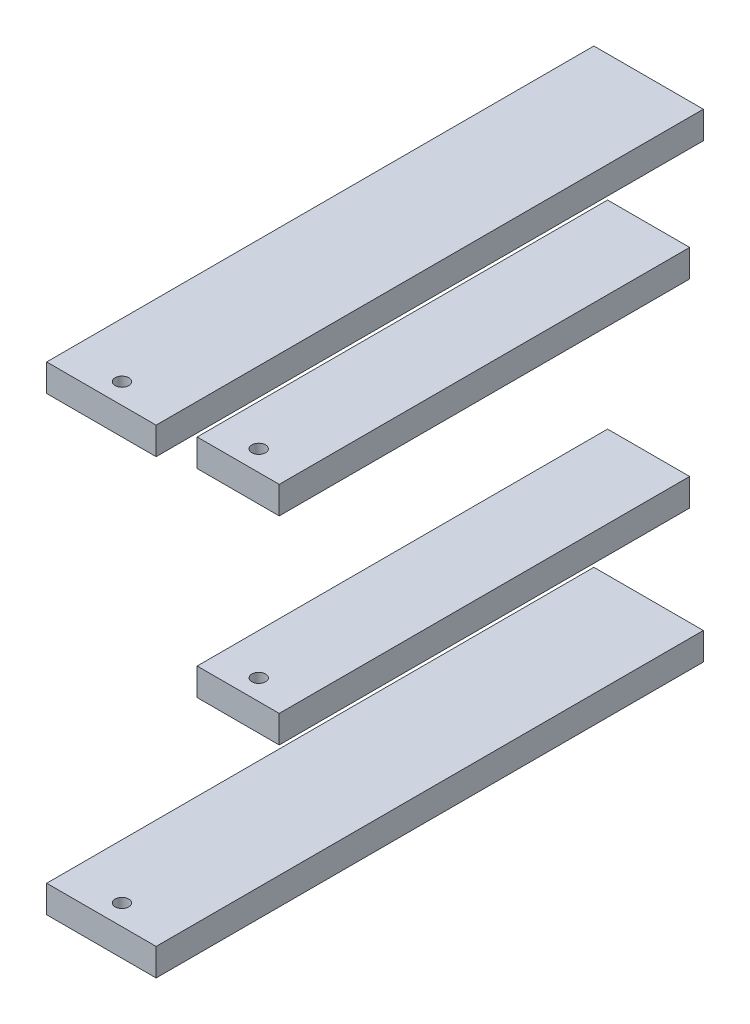
ISO-10303-21;
HEADER;
FILE_DESCRIPTION(('STEP AP214'),'2;1');
FILE_NAME('part.step','',(''),(''),'','','');
FILE_SCHEMA(('AUTOMOTIVE_DESIGN { 1 0 10303 214 1 1 1 1 }'));
ENDSEC;
DATA;
#1=APPLICATION_CONTEXT('core data for automotive mechanical design processes');
#2=APPLICATION_PROTOCOL_DEFINITION('international standard','automotive_design',2000,#1);
#3=PRODUCT_CONTEXT('',#1,'mechanical');
#4=PRODUCT('Part','Part','',(#3));
#5=PRODUCT_RELATED_PRODUCT_CATEGORY('part','',(#4));
#6=PRODUCT_DEFINITION_FORMATION('','',#4);
#7=PRODUCT_DEFINITION_CONTEXT('part definition',#1,'design');
#8=PRODUCT_DEFINITION('design','',#6,#7);
#9=PRODUCT_DEFINITION_SHAPE('','',#8);
#10=(LENGTH_UNIT() NAMED_UNIT(*) SI_UNIT(.MILLI.,.METRE.));
#11=(NAMED_UNIT(*) PLANE_ANGLE_UNIT() SI_UNIT($,.RADIAN.));
#12=(NAMED_UNIT(*) SI_UNIT($,.STERADIAN.) SOLID_ANGLE_UNIT());
#13=UNCERTAINTY_MEASURE_WITH_UNIT(LENGTH_MEASURE(1.E-05),#10,'distance_accuracy_value','');
#14=(GEOMETRIC_REPRESENTATION_CONTEXT(3) GLOBAL_UNCERTAINTY_ASSIGNED_CONTEXT((#13)) GLOBAL_UNIT_ASSIGNED_CONTEXT((#10,
#11,#12)) REPRESENTATION_CONTEXT('',''));
#15=CARTESIAN_POINT('',(0.,0.,0.));
#16=DIRECTION('',(0.,0.,1.));
#17=DIRECTION('',(1.,0.,0.));
#18=AXIS2_PLACEMENT_3D('',#15,#16,#17);
#19=CARTESIAN_POINT('',(-30.,-62.5,300.));
#20=DIRECTION('',(0.,-1.,0.));
#21=DIRECTION('',(1.,0.,0.));
#22=AXIS2_PLACEMENT_3D('',#19,#20,#21);
#23=PLANE('',#22);
#24=CARTESIAN_POINT('',(0.,-62.4999999999999,285.));
#25=DIRECTION('',(0.,-1.,0.));
#26=DIRECTION('',(1.,0.,0.));
#27=AXIS2_PLACEMENT_3D('',#24,#25,#26);
#28=CIRCLE('',#27,5.00000000000002);
#29=CARTESIAN_POINT('',(5.00000000000004,-62.4999999999999,285.));
#30=VERTEX_POINT('',#29);
#31=EDGE_CURVE('E111',#30,#30,#28,.T.);
#32=ORIENTED_EDGE('',*,*,#31,.T.);
#33=EDGE_LOOP('',(#32));
#34=FACE_BOUND('',#33,.T.);
#35=DIRECTION('',(-1.,0.,0.));
#36=VECTOR('',#35,1.);
#37=CARTESIAN_POINT('',(-30.,-62.5,0.));
#38=LINE('',#37,#36);
#39=CARTESIAN_POINT('',(30.0000000000001,-62.4999999999999,0.));
#40=VERTEX_POINT('',#39);
#41=CARTESIAN_POINT('',(-30.,-62.5,0.));
#42=VERTEX_POINT('',#41);
#43=EDGE_CURVE('E108',#40,#42,#38,.T.);
#44=ORIENTED_EDGE('',*,*,#43,.T.);
#45=DIRECTION('',(0.,0.,-1.));
#46=VECTOR('',#45,1.);
#47=CARTESIAN_POINT('',(-30.,-62.5,300.));
#48=LINE('',#47,#46);
#49=CARTESIAN_POINT('',(-30.,-62.5,300.));
#50=VERTEX_POINT('',#49);
#51=EDGE_CURVE('E12',#50,#42,#48,.T.);
#52=ORIENTED_EDGE('',*,*,#51,.F.);
#53=DIRECTION('',(-1.,0.,0.));
#54=VECTOR('',#53,1.);
#55=CARTESIAN_POINT('',(-30.,-62.5,300.));
#56=LINE('',#55,#54);
#57=CARTESIAN_POINT('',(30.0000000000001,-62.4999999999999,300.));
#58=VERTEX_POINT('',#57);
#59=EDGE_CURVE('E96',#58,#50,#56,.T.);
#60=ORIENTED_EDGE('',*,*,#59,.F.);
#61=DIRECTION('',(0.,0.,-1.));
#62=VECTOR('',#61,1.);
#63=CARTESIAN_POINT('',(30.0000000000001,-62.4999999999999,300.));
#64=LINE('',#63,#62);
#65=EDGE_CURVE('E104',#58,#40,#64,.T.);
#66=ORIENTED_EDGE('',*,*,#65,.T.);
#67=EDGE_LOOP('',(#44,#52,#60,#66));
#68=FACE_BOUND('',#67,.T.);
#69=ADVANCED_FACE('F45',(#34,#68),#23,.F.);
#70=CARTESIAN_POINT('',(-30.,-62.5,300.));
#71=DIRECTION('',(1.,0.,0.));
#72=DIRECTION('',(0.,0.,-1.));
#73=AXIS2_PLACEMENT_3D('',#70,#71,#72);
#74=PLANE('',#73);
#75=DIRECTION('',(0.,-1.,0.));
#76=VECTOR('',#75,1.);
#77=CARTESIAN_POINT('',(-30.,-62.5,0.));
#78=LINE('',#77,#76);
#79=CARTESIAN_POINT('',(-30.,-82.5,0.));
#80=VERTEX_POINT('',#79);
#81=EDGE_CURVE('E100',#42,#80,#78,.T.);
#82=ORIENTED_EDGE('',*,*,#81,.T.);
#83=DIRECTION('',(0.,0.,-1.));
#84=VECTOR('',#83,1.);
#85=CARTESIAN_POINT('',(-30.,-82.5,300.));
#86=LINE('',#85,#84);
#87=CARTESIAN_POINT('',(-30.,-82.5,300.));
#88=VERTEX_POINT('',#87);
#89=EDGE_CURVE('E53',#88,#80,#86,.T.);
#90=ORIENTED_EDGE('',*,*,#89,.F.);
#91=DIRECTION('',(0.,-1.,0.));
#92=VECTOR('',#91,1.);
#93=CARTESIAN_POINT('',(-30.,-62.5,300.));
#94=LINE('',#93,#92);
#95=EDGE_CURVE('E91',#50,#88,#94,.T.);
#96=ORIENTED_EDGE('',*,*,#95,.F.);
#97=ORIENTED_EDGE('',*,*,#51,.T.);
#98=EDGE_LOOP('',(#82,#90,#96,#97));
#99=FACE_BOUND('',#98,.T.);
#100=ADVANCED_FACE('F99',(#99),#74,.F.);
#101=CARTESIAN_POINT('',(-30.,-82.5,300.));
#102=DIRECTION('',(0.,1.,0.));
#103=DIRECTION('',(-1.,0.,0.));
#104=AXIS2_PLACEMENT_3D('',#101,#102,#103);
#105=PLANE('',#104);
#106=CARTESIAN_POINT('',(0.,-82.5,285.));
#107=DIRECTION('',(0.,-1.,0.));
#108=DIRECTION('',(0.,0.,-1.));
#109=AXIS2_PLACEMENT_3D('',#106,#107,#108);
#110=CIRCLE('',#109,5.00000000000002);
#111=CARTESIAN_POINT('',(0.,-82.5,280.));
#112=VERTEX_POINT('',#111);
#113=EDGE_CURVE('E124',#112,#112,#110,.T.);
#114=ORIENTED_EDGE('',*,*,#113,.F.);
#115=EDGE_LOOP('',(#114));
#116=FACE_BOUND('',#115,.T.);
#117=DIRECTION('',(1.,0.,0.));
#118=VECTOR('',#117,1.);
#119=CARTESIAN_POINT('',(-30.,-82.5,0.));
#120=LINE('',#119,#118);
#121=CARTESIAN_POINT('',(30.0000000000001,-82.4999999999999,0.));
#122=VERTEX_POINT('',#121);
#123=EDGE_CURVE('E78',#80,#122,#120,.T.);
#124=ORIENTED_EDGE('',*,*,#123,.T.);
#125=DIRECTION('',(0.,0.,-1.));
#126=VECTOR('',#125,1.);
#127=CARTESIAN_POINT('',(30.0000000000001,-82.4999999999999,300.));
#128=LINE('',#127,#126);
#129=CARTESIAN_POINT('',(30.0000000000001,-82.4999999999999,300.));
#130=VERTEX_POINT('',#129);
#131=EDGE_CURVE('E101',#130,#122,#128,.T.);
#132=ORIENTED_EDGE('',*,*,#131,.F.);
#133=DIRECTION('',(1.,0.,0.));
#134=VECTOR('',#133,1.);
#135=CARTESIAN_POINT('',(-30.,-82.5,300.));
#136=LINE('',#135,#134);
#137=EDGE_CURVE('E94',#88,#130,#136,.T.);
#138=ORIENTED_EDGE('',*,*,#137,.F.);
#139=ORIENTED_EDGE('',*,*,#89,.T.);
#140=EDGE_LOOP('',(#124,#132,#138,#139));
#141=FACE_BOUND('',#140,.T.);
#142=ADVANCED_FACE('F102',(#116,#141),#105,.F.);
#143=CARTESIAN_POINT('',(30.0000000000001,-62.4999999999999,300.));
#144=DIRECTION('',(-1.,0.,0.));
#145=DIRECTION('',(0.,0.,1.));
#146=AXIS2_PLACEMENT_3D('',#143,#144,#145);
#147=PLANE('',#146);
#148=DIRECTION('',(0.,1.,0.));
#149=VECTOR('',#148,1.);
#150=CARTESIAN_POINT('',(30.0000000000001,-62.4999999999999,0.));
#151=LINE('',#150,#149);
#152=EDGE_CURVE('E84',#122,#40,#151,.T.);
#153=ORIENTED_EDGE('',*,*,#152,.T.);
#154=ORIENTED_EDGE('',*,*,#65,.F.);
#155=DIRECTION('',(0.,1.,0.));
#156=VECTOR('',#155,1.);
#157=CARTESIAN_POINT('',(30.0000000000001,-62.4999999999999,300.));
#158=LINE('',#157,#156);
#159=EDGE_CURVE('E61',#130,#58,#158,.T.);
#160=ORIENTED_EDGE('',*,*,#159,.F.);
#161=ORIENTED_EDGE('',*,*,#131,.T.);
#162=EDGE_LOOP('',(#153,#154,#160,#161));
#163=FACE_BOUND('',#162,.T.);
#164=ADVANCED_FACE('F116',(#163),#147,.F.);
#165=CARTESIAN_POINT('',(0.,0.,300.));
#166=DIRECTION('',(0.,0.,-1.));
#167=DIRECTION('',(-1.,0.,0.));
#168=AXIS2_PLACEMENT_3D('',#165,#166,#167);
#169=PLANE('',#168);
#170=ORIENTED_EDGE('',*,*,#59,.T.);
#171=ORIENTED_EDGE('',*,*,#95,.T.);
#172=ORIENTED_EDGE('',*,*,#137,.T.);
#173=ORIENTED_EDGE('',*,*,#159,.T.);
#174=EDGE_LOOP('',(#170,#171,#172,#173));
#175=FACE_BOUND('',#174,.T.);
#176=ADVANCED_FACE('F92',(#175),#169,.F.);
#177=CARTESIAN_POINT('',(0.,0.,0.));
#178=DIRECTION('',(0.,0.,-1.));
#179=DIRECTION('',(-1.,0.,0.));
#180=AXIS2_PLACEMENT_3D('',#177,#178,#179);
#181=PLANE('',#180);
#182=ORIENTED_EDGE('',*,*,#43,.F.);
#183=ORIENTED_EDGE('',*,*,#152,.F.);
#184=ORIENTED_EDGE('',*,*,#123,.F.);
#185=ORIENTED_EDGE('',*,*,#81,.F.);
#186=EDGE_LOOP('',(#182,#183,#184,#185));
#187=FACE_BOUND('',#186,.T.);
#188=ADVANCED_FACE('F119',(#187),#181,.T.);
#189=CARTESIAN_POINT('',(0.,217.5,285.));
#190=DIRECTION('',(0.,-1.,0.));
#191=DIRECTION('',(0.,0.,-1.));
#192=AXIS2_PLACEMENT_3D('',#189,#190,#191);
#193=CYLINDRICAL_SURFACE('',#192,5.00000000000002);
#194=ORIENTED_EDGE('',*,*,#113,.T.);
#195=EDGE_LOOP('',(#194));
#196=FACE_BOUND('',#195,.T.);
#197=ORIENTED_EDGE('',*,*,#31,.F.);
#198=EDGE_LOOP('',(#197));
#199=FACE_BOUND('',#198,.T.);
#200=ADVANCED_FACE('F128',(#196,#199),#193,.F.);
#201=CLOSED_SHELL('',(#69,#100,#142,#164,#176,#188,#200));
#202=MANIFOLD_SOLID_BREP('B2',#201);
#203=CARTESIAN_POINT('',(30.,62.5,300.));
#204=DIRECTION('',(-1.,0.,0.));
#205=DIRECTION('',(0.,0.,1.));
#206=AXIS2_PLACEMENT_3D('',#203,#204,#205);
#207=PLANE('',#206);
#208=DIRECTION('',(0.,1.,0.));
#209=VECTOR('',#208,1.);
#210=CARTESIAN_POINT('',(30.,62.5,0.));
#211=LINE('',#210,#209);
#212=CARTESIAN_POINT('',(30.,62.5,0.));
#213=VERTEX_POINT('',#212);
#214=CARTESIAN_POINT('',(30.,82.5,0.));
#215=VERTEX_POINT('',#214);
#216=EDGE_CURVE('E264',#213,#215,#211,.T.);
#217=ORIENTED_EDGE('',*,*,#216,.T.);
#218=DIRECTION('',(0.,0.,-1.));
#219=VECTOR('',#218,1.);
#220=CARTESIAN_POINT('',(30.,82.5,300.));
#221=LINE('',#220,#219);
#222=CARTESIAN_POINT('',(30.,82.5,300.));
#223=VERTEX_POINT('',#222);
#224=EDGE_CURVE('E43',#223,#215,#221,.T.);
#225=ORIENTED_EDGE('',*,*,#224,.F.);
#226=DIRECTION('',(0.,1.,0.));
#227=VECTOR('',#226,1.);
#228=CARTESIAN_POINT('',(30.,62.5,300.));
#229=LINE('',#228,#227);
#230=CARTESIAN_POINT('',(30.,62.5,300.));
#231=VERTEX_POINT('',#230);
#232=EDGE_CURVE('E251',#231,#223,#229,.T.);
#233=ORIENTED_EDGE('',*,*,#232,.F.);
#234=DIRECTION('',(0.,0.,-1.));
#235=VECTOR('',#234,1.);
#236=CARTESIAN_POINT('',(30.,62.5,300.));
#237=LINE('',#236,#235);
#238=EDGE_CURVE('E260',#231,#213,#237,.T.);
#239=ORIENTED_EDGE('',*,*,#238,.T.);
#240=EDGE_LOOP('',(#217,#225,#233,#239));
#241=FACE_BOUND('',#240,.T.);
#242=ADVANCED_FACE('F199',(#241),#207,.F.);
#243=CARTESIAN_POINT('',(-30.,82.5,300.));
#244=DIRECTION('',(0.,-1.,0.));
#245=DIRECTION('',(1.,0.,0.));
#246=AXIS2_PLACEMENT_3D('',#243,#244,#245);
#247=PLANE('',#246);
#248=CARTESIAN_POINT('',(0.,82.5,285.));
#249=DIRECTION('',(0.,-1.,0.));
#250=DIRECTION('',(1.,0.,0.));
#251=AXIS2_PLACEMENT_3D('',#248,#249,#250);
#252=CIRCLE('',#251,5.00000000000002);
#253=CARTESIAN_POINT('',(5.00000000000004,82.5,285.));
#254=VERTEX_POINT('',#253);
#255=EDGE_CURVE('E267',#254,#254,#252,.T.);
#256=ORIENTED_EDGE('',*,*,#255,.T.);
#257=EDGE_LOOP('',(#256));
#258=FACE_BOUND('',#257,.T.);
#259=DIRECTION('',(-1.,0.,0.));
#260=VECTOR('',#259,1.);
#261=CARTESIAN_POINT('',(-30.,82.5,0.));
#262=LINE('',#261,#260);
#263=CARTESIAN_POINT('',(-30.,82.5,0.));
#264=VERTEX_POINT('',#263);
#265=EDGE_CURVE('E255',#215,#264,#262,.T.);
#266=ORIENTED_EDGE('',*,*,#265,.T.);
#267=DIRECTION('',(0.,0.,-1.));
#268=VECTOR('',#267,1.);
#269=CARTESIAN_POINT('',(-30.,82.5,300.));
#270=LINE('',#269,#268);
#271=CARTESIAN_POINT('',(-30.,82.5,300.));
#272=VERTEX_POINT('',#271);
#273=EDGE_CURVE('E208',#272,#264,#270,.T.);
#274=ORIENTED_EDGE('',*,*,#273,.F.);
#275=DIRECTION('',(-1.,0.,0.));
#276=VECTOR('',#275,1.);
#277=CARTESIAN_POINT('',(-30.,82.5,300.));
#278=LINE('',#277,#276);
#279=EDGE_CURVE('E246',#223,#272,#278,.T.);
#280=ORIENTED_EDGE('',*,*,#279,.F.);
#281=ORIENTED_EDGE('',*,*,#224,.T.);
#282=EDGE_LOOP('',(#266,#274,#280,#281));
#283=FACE_BOUND('',#282,.T.);
#284=ADVANCED_FACE('F254',(#258,#283),#247,.F.);
#285=CARTESIAN_POINT('',(-30.,62.5,300.));
#286=DIRECTION('',(1.,0.,0.));
#287=DIRECTION('',(0.,0.,-1.));
#288=AXIS2_PLACEMENT_3D('',#285,#286,#287);
#289=PLANE('',#288);
#290=DIRECTION('',(0.,-1.,0.));
#291=VECTOR('',#290,1.);
#292=CARTESIAN_POINT('',(-30.,62.5,0.));
#293=LINE('',#292,#291);
#294=CARTESIAN_POINT('',(-30.,62.5,0.));
#295=VERTEX_POINT('',#294);
#296=EDGE_CURVE('E233',#264,#295,#293,.T.);
#297=ORIENTED_EDGE('',*,*,#296,.T.);
#298=DIRECTION('',(0.,0.,-1.));
#299=VECTOR('',#298,1.);
#300=CARTESIAN_POINT('',(-30.,62.5,300.));
#301=LINE('',#300,#299);
#302=CARTESIAN_POINT('',(-30.,62.5,300.));
#303=VERTEX_POINT('',#302);
#304=EDGE_CURVE('E256',#303,#295,#301,.T.);
#305=ORIENTED_EDGE('',*,*,#304,.F.);
#306=DIRECTION('',(0.,-1.,0.));
#307=VECTOR('',#306,1.);
#308=CARTESIAN_POINT('',(-30.,62.5,300.));
#309=LINE('',#308,#307);
#310=EDGE_CURVE('E249',#272,#303,#309,.T.);
#311=ORIENTED_EDGE('',*,*,#310,.F.);
#312=ORIENTED_EDGE('',*,*,#273,.T.);
#313=EDGE_LOOP('',(#297,#305,#311,#312));
#314=FACE_BOUND('',#313,.T.);
#315=ADVANCED_FACE('F258',(#314),#289,.F.);
#316=CARTESIAN_POINT('',(-30.,62.5,300.));
#317=DIRECTION('',(0.,1.,0.));
#318=DIRECTION('',(-1.,0.,0.));
#319=AXIS2_PLACEMENT_3D('',#316,#317,#318);
#320=PLANE('',#319);
#321=CARTESIAN_POINT('',(0.,62.4999999999999,285.));
#322=DIRECTION('',(0.,1.,0.));
#323=DIRECTION('',(-1.,0.,0.));
#324=AXIS2_PLACEMENT_3D('',#321,#322,#323);
#325=CIRCLE('',#324,5.00000000000002);
#326=CARTESIAN_POINT('',(-5.,62.4999999999999,285.));
#327=VERTEX_POINT('',#326);
#328=EDGE_CURVE('E202',#327,#327,#325,.T.);
#329=ORIENTED_EDGE('',*,*,#328,.T.);
#330=EDGE_LOOP('',(#329));
#331=FACE_BOUND('',#330,.T.);
#332=DIRECTION('',(1.,0.,0.));
#333=VECTOR('',#332,1.);
#334=CARTESIAN_POINT('',(-30.,62.5,0.));
#335=LINE('',#334,#333);
#336=EDGE_CURVE('E239',#295,#213,#335,.T.);
#337=ORIENTED_EDGE('',*,*,#336,.T.);
#338=ORIENTED_EDGE('',*,*,#238,.F.);
#339=DIRECTION('',(1.,0.,0.));
#340=VECTOR('',#339,1.);
#341=CARTESIAN_POINT('',(-30.,62.5,300.));
#342=LINE('',#341,#340);
#343=EDGE_CURVE('E216',#303,#231,#342,.T.);
#344=ORIENTED_EDGE('',*,*,#343,.F.);
#345=ORIENTED_EDGE('',*,*,#304,.T.);
#346=EDGE_LOOP('',(#337,#338,#344,#345));
#347=FACE_BOUND('',#346,.T.);
#348=ADVANCED_FACE('F272',(#331,#347),#320,.F.);
#349=CARTESIAN_POINT('',(0.,0.,300.));
#350=DIRECTION('',(0.,0.,-1.));
#351=DIRECTION('',(-1.,0.,0.));
#352=AXIS2_PLACEMENT_3D('',#349,#350,#351);
#353=PLANE('',#352);
#354=ORIENTED_EDGE('',*,*,#232,.T.);
#355=ORIENTED_EDGE('',*,*,#279,.T.);
#356=ORIENTED_EDGE('',*,*,#310,.T.);
#357=ORIENTED_EDGE('',*,*,#343,.T.);
#358=EDGE_LOOP('',(#354,#355,#356,#357));
#359=FACE_BOUND('',#358,.T.);
#360=ADVANCED_FACE('F247',(#359),#353,.F.);
#361=CARTESIAN_POINT('',(0.,0.,0.));
#362=DIRECTION('',(0.,0.,-1.));
#363=DIRECTION('',(-1.,0.,0.));
#364=AXIS2_PLACEMENT_3D('',#361,#362,#363);
#365=PLANE('',#364);
#366=ORIENTED_EDGE('',*,*,#216,.F.);
#367=ORIENTED_EDGE('',*,*,#336,.F.);
#368=ORIENTED_EDGE('',*,*,#296,.F.);
#369=ORIENTED_EDGE('',*,*,#265,.F.);
#370=EDGE_LOOP('',(#366,#367,#368,#369));
#371=FACE_BOUND('',#370,.T.);
#372=ADVANCED_FACE('F275',(#371),#365,.T.);
#373=CARTESIAN_POINT('',(0.,217.5,285.));
#374=DIRECTION('',(0.,-1.,0.));
#375=DIRECTION('',(0.,0.,-1.));
#376=AXIS2_PLACEMENT_3D('',#373,#374,#375);
#377=CYLINDRICAL_SURFACE('',#376,5.00000000000002);
#378=ORIENTED_EDGE('',*,*,#328,.F.);
#379=EDGE_LOOP('',(#378));
#380=FACE_BOUND('',#379,.T.);
#381=ORIENTED_EDGE('',*,*,#255,.F.);
#382=EDGE_LOOP('',(#381));
#383=FACE_BOUND('',#382,.T.);
#384=ADVANCED_FACE('F285',(#380,#383),#377,.F.);
#385=CLOSED_SHELL('',(#242,#284,#315,#348,#360,#372,#384));
#386=MANIFOLD_SOLID_BREP('B6',#385);
#387=CARTESIAN_POINT('',(40.,-175.,400.));
#388=DIRECTION('',(-1.,0.,0.));
#389=DIRECTION('',(0.,0.,1.));
#390=AXIS2_PLACEMENT_3D('',#387,#388,#389);
#391=PLANE('',#390);
#392=DIRECTION('',(0.,1.,0.));
#393=VECTOR('',#392,1.);
#394=CARTESIAN_POINT('',(40.,-175.,0.));
#395=LINE('',#394,#393);
#396=CARTESIAN_POINT('',(40.,-175.,0.));
#397=VERTEX_POINT('',#396);
#398=CARTESIAN_POINT('',(40.,-155.,0.));
#399=VERTEX_POINT('',#398);
#400=EDGE_CURVE('E415',#397,#399,#395,.T.);
#401=ORIENTED_EDGE('',*,*,#400,.T.);
#402=DIRECTION('',(0.,0.,-1.));
#403=VECTOR('',#402,1.);
#404=CARTESIAN_POINT('',(40.,-155.,400.));
#405=LINE('',#404,#403);
#406=CARTESIAN_POINT('',(40.,-155.,400.));
#407=VERTEX_POINT('',#406);
#408=EDGE_CURVE('E197',#407,#399,#405,.T.);
#409=ORIENTED_EDGE('',*,*,#408,.F.);
#410=DIRECTION('',(0.,1.,0.));
#411=VECTOR('',#410,1.);
#412=CARTESIAN_POINT('',(40.,-175.,400.));
#413=LINE('',#412,#411);
#414=CARTESIAN_POINT('',(40.,-175.,400.));
#415=VERTEX_POINT('',#414);
#416=EDGE_CURVE('E403',#415,#407,#413,.T.);
#417=ORIENTED_EDGE('',*,*,#416,.F.);
#418=DIRECTION('',(0.,0.,-1.));
#419=VECTOR('',#418,1.);
#420=CARTESIAN_POINT('',(40.,-175.,400.));
#421=LINE('',#420,#419);
#422=EDGE_CURVE('E411',#415,#397,#421,.T.);
#423=ORIENTED_EDGE('',*,*,#422,.T.);
#424=EDGE_LOOP('',(#401,#409,#417,#423));
#425=FACE_BOUND('',#424,.T.);
#426=ADVANCED_FACE('F352',(#425),#391,.F.);
#427=CARTESIAN_POINT('',(-40.,-155.,400.));
#428=DIRECTION('',(0.,-1.,0.));
#429=DIRECTION('',(1.,0.,0.));
#430=AXIS2_PLACEMENT_3D('',#427,#428,#429);
#431=PLANE('',#430);
#432=CARTESIAN_POINT('',(0.,-155.,385.));
#433=DIRECTION('',(0.,-1.,0.));
#434=DIRECTION('',(1.,0.,0.));
#435=AXIS2_PLACEMENT_3D('',#432,#433,#434);
#436=CIRCLE('',#435,5.);
#437=CARTESIAN_POINT('',(4.99999999999995,-155.,385.));
#438=VERTEX_POINT('',#437);
#439=EDGE_CURVE('E418',#438,#438,#436,.T.);
#440=ORIENTED_EDGE('',*,*,#439,.T.);
#441=EDGE_LOOP('',(#440));
#442=FACE_BOUND('',#441,.T.);
#443=DIRECTION('',(-1.,0.,0.));
#444=VECTOR('',#443,1.);
#445=CARTESIAN_POINT('',(-40.,-155.,0.));
#446=LINE('',#445,#444);
#447=CARTESIAN_POINT('',(-40.,-155.,0.));
#448=VERTEX_POINT('',#447);
#449=EDGE_CURVE('E407',#399,#448,#446,.T.);
#450=ORIENTED_EDGE('',*,*,#449,.T.);
#451=DIRECTION('',(0.,0.,-1.));
#452=VECTOR('',#451,1.);
#453=CARTESIAN_POINT('',(-40.,-155.,400.));
#454=LINE('',#453,#452);
#455=CARTESIAN_POINT('',(-40.,-155.,400.));
#456=VERTEX_POINT('',#455);
#457=EDGE_CURVE('E360',#456,#448,#454,.T.);
#458=ORIENTED_EDGE('',*,*,#457,.F.);
#459=DIRECTION('',(-1.,0.,0.));
#460=VECTOR('',#459,1.);
#461=CARTESIAN_POINT('',(-40.,-155.,400.));
#462=LINE('',#461,#460);
#463=EDGE_CURVE('E398',#407,#456,#462,.T.);
#464=ORIENTED_EDGE('',*,*,#463,.F.);
#465=ORIENTED_EDGE('',*,*,#408,.T.);
#466=EDGE_LOOP('',(#450,#458,#464,#465));
#467=FACE_BOUND('',#466,.T.);
#468=ADVANCED_FACE('F406',(#442,#467),#431,.F.);
#469=CARTESIAN_POINT('',(-40.,-175.,400.));
#470=DIRECTION('',(1.,0.,0.));
#471=DIRECTION('',(0.,0.,-1.));
#472=AXIS2_PLACEMENT_3D('',#469,#470,#471);
#473=PLANE('',#472);
#474=DIRECTION('',(0.,-1.,0.));
#475=VECTOR('',#474,1.);
#476=CARTESIAN_POINT('',(-40.,-175.,0.));
#477=LINE('',#476,#475);
#478=CARTESIAN_POINT('',(-40.,-175.,0.));
#479=VERTEX_POINT('',#478);
#480=EDGE_CURVE('E385',#448,#479,#477,.T.);
#481=ORIENTED_EDGE('',*,*,#480,.T.);
#482=DIRECTION('',(0.,0.,-1.));
#483=VECTOR('',#482,1.);
#484=CARTESIAN_POINT('',(-40.,-175.,400.));
#485=LINE('',#484,#483);
#486=CARTESIAN_POINT('',(-40.,-175.,400.));
#487=VERTEX_POINT('',#486);
#488=EDGE_CURVE('E408',#487,#479,#485,.T.);
#489=ORIENTED_EDGE('',*,*,#488,.F.);
#490=DIRECTION('',(0.,-1.,0.));
#491=VECTOR('',#490,1.);
#492=CARTESIAN_POINT('',(-40.,-175.,400.));
#493=LINE('',#492,#491);
#494=EDGE_CURVE('E401',#456,#487,#493,.T.);
#495=ORIENTED_EDGE('',*,*,#494,.F.);
#496=ORIENTED_EDGE('',*,*,#457,.T.);
#497=EDGE_LOOP('',(#481,#489,#495,#496));
#498=FACE_BOUND('',#497,.T.);
#499=ADVANCED_FACE('F409',(#498),#473,.F.);
#500=CARTESIAN_POINT('',(-40.,-175.,400.));
#501=DIRECTION('',(0.,1.,0.));
#502=DIRECTION('',(-1.,0.,0.));
#503=AXIS2_PLACEMENT_3D('',#500,#501,#502);
#504=PLANE('',#503);
#505=CARTESIAN_POINT('',(0.,-175.,385.));
#506=DIRECTION('',(0.,-1.,0.));
#507=DIRECTION('',(1.,0.,0.));
#508=AXIS2_PLACEMENT_3D('',#505,#506,#507);
#509=CIRCLE('',#508,5.);
#510=CARTESIAN_POINT('',(4.99999999999995,-175.,385.));
#511=VERTEX_POINT('',#510);
#512=EDGE_CURVE('E431',#511,#511,#509,.T.);
#513=ORIENTED_EDGE('',*,*,#512,.F.);
#514=EDGE_LOOP('',(#513));
#515=FACE_BOUND('',#514,.T.);
#516=DIRECTION('',(1.,0.,0.));
#517=VECTOR('',#516,1.);
#518=CARTESIAN_POINT('',(-40.,-175.,0.));
#519=LINE('',#518,#517);
#520=EDGE_CURVE('E391',#479,#397,#519,.T.);
#521=ORIENTED_EDGE('',*,*,#520,.T.);
#522=ORIENTED_EDGE('',*,*,#422,.F.);
#523=DIRECTION('',(1.,0.,0.));
#524=VECTOR('',#523,1.);
#525=CARTESIAN_POINT('',(-40.,-175.,400.));
#526=LINE('',#525,#524);
#527=EDGE_CURVE('E368',#487,#415,#526,.T.);
#528=ORIENTED_EDGE('',*,*,#527,.F.);
#529=ORIENTED_EDGE('',*,*,#488,.T.);
#530=EDGE_LOOP('',(#521,#522,#528,#529));
#531=FACE_BOUND('',#530,.T.);
#532=ADVANCED_FACE('F423',(#515,#531),#504,.F.);
#533=CARTESIAN_POINT('',(0.,0.,400.));
#534=DIRECTION('',(0.,0.,-1.));
#535=DIRECTION('',(-1.,0.,0.));
#536=AXIS2_PLACEMENT_3D('',#533,#534,#535);
#537=PLANE('',#536);
#538=ORIENTED_EDGE('',*,*,#416,.T.);
#539=ORIENTED_EDGE('',*,*,#463,.T.);
#540=ORIENTED_EDGE('',*,*,#494,.T.);
#541=ORIENTED_EDGE('',*,*,#527,.T.);
#542=EDGE_LOOP('',(#538,#539,#540,#541));
#543=FACE_BOUND('',#542,.T.);
#544=ADVANCED_FACE('F399',(#543),#537,.F.);
#545=CARTESIAN_POINT('',(0.,0.,0.));
#546=DIRECTION('',(0.,0.,-1.));
#547=DIRECTION('',(-1.,0.,0.));
#548=AXIS2_PLACEMENT_3D('',#545,#546,#547);
#549=PLANE('',#548);
#550=ORIENTED_EDGE('',*,*,#400,.F.);
#551=ORIENTED_EDGE('',*,*,#520,.F.);
#552=ORIENTED_EDGE('',*,*,#480,.F.);
#553=ORIENTED_EDGE('',*,*,#449,.F.);
#554=EDGE_LOOP('',(#550,#551,#552,#553));
#555=FACE_BOUND('',#554,.T.);
#556=ADVANCED_FACE('F426',(#555),#549,.T.);
#557=CARTESIAN_POINT('',(0.,225.,385.));
#558=DIRECTION('',(0.,-1.,0.));
#559=DIRECTION('',(1.,0.,0.));
#560=AXIS2_PLACEMENT_3D('',#557,#558,#559);
#561=CYLINDRICAL_SURFACE('',#560,5.);
#562=ORIENTED_EDGE('',*,*,#512,.T.);
#563=EDGE_LOOP('',(#562));
#564=FACE_BOUND('',#563,.T.);
#565=ORIENTED_EDGE('',*,*,#439,.F.);
#566=EDGE_LOOP('',(#565));
#567=FACE_BOUND('',#566,.T.);
#568=ADVANCED_FACE('F435',(#564,#567),#561,.F.);
#569=CLOSED_SHELL('',(#426,#468,#499,#532,#544,#556,#568));
#570=MANIFOLD_SOLID_BREP('B37',#569);
#571=CARTESIAN_POINT('',(40.,155.,400.));
#572=DIRECTION('',(-1.,0.,0.));
#573=DIRECTION('',(0.,-1.,0.));
#574=AXIS2_PLACEMENT_3D('',#571,#572,#573);
#575=PLANE('',#574);
#576=DIRECTION('',(0.,1.,0.));
#577=VECTOR('',#576,1.);
#578=CARTESIAN_POINT('',(40.,155.,0.));
#579=LINE('',#578,#577);
#580=CARTESIAN_POINT('',(40.,155.,0.));
#581=VERTEX_POINT('',#580);
#582=CARTESIAN_POINT('',(40.,175.,0.));
#583=VERTEX_POINT('',#582);
#584=EDGE_CURVE('E561',#581,#583,#579,.T.);
#585=ORIENTED_EDGE('',*,*,#584,.T.);
#586=DIRECTION('',(0.,0.,-1.));
#587=VECTOR('',#586,1.);
#588=CARTESIAN_POINT('',(40.,175.,400.));
#589=LINE('',#588,#587);
#590=CARTESIAN_POINT('',(40.,175.,400.));
#591=VERTEX_POINT('',#590);
#592=EDGE_CURVE('E350',#591,#583,#589,.T.);
#593=ORIENTED_EDGE('',*,*,#592,.F.);
#594=DIRECTION('',(0.,1.,0.));
#595=VECTOR('',#594,1.);
#596=CARTESIAN_POINT('',(40.,155.,400.));
#597=LINE('',#596,#595);
#598=CARTESIAN_POINT('',(40.,155.,400.));
#599=VERTEX_POINT('',#598);
#600=EDGE_CURVE('E548',#599,#591,#597,.T.);
#601=ORIENTED_EDGE('',*,*,#600,.F.);
#602=DIRECTION('',(0.,0.,-1.));
#603=VECTOR('',#602,1.);
#604=CARTESIAN_POINT('',(40.,155.,400.));
#605=LINE('',#604,#603);
#606=EDGE_CURVE('E557',#599,#581,#605,.T.);
#607=ORIENTED_EDGE('',*,*,#606,.T.);
#608=EDGE_LOOP('',(#585,#593,#601,#607));
#609=FACE_BOUND('',#608,.T.);
#610=ADVANCED_FACE('F496',(#609),#575,.F.);
#611=CARTESIAN_POINT('',(-40.,175.,400.));
#612=DIRECTION('',(0.,-1.,0.));
#613=DIRECTION('',(0.,0.,-1.));
#614=AXIS2_PLACEMENT_3D('',#611,#612,#613);
#615=PLANE('',#614);
#616=CARTESIAN_POINT('',(0.,175.,385.));
#617=DIRECTION('',(0.,-1.,0.));
#618=DIRECTION('',(0.,0.,-1.));
#619=AXIS2_PLACEMENT_3D('',#616,#617,#618);
#620=CIRCLE('',#619,5.);
#621=CARTESIAN_POINT('',(0.,175.,380.));
#622=VERTEX_POINT('',#621);
#623=EDGE_CURVE('E564',#622,#622,#620,.T.);
#624=ORIENTED_EDGE('',*,*,#623,.T.);
#625=EDGE_LOOP('',(#624));
#626=FACE_BOUND('',#625,.T.);
#627=DIRECTION('',(-1.,0.,0.));
#628=VECTOR('',#627,1.);
#629=CARTESIAN_POINT('',(-40.,175.,0.));
#630=LINE('',#629,#628);
#631=CARTESIAN_POINT('',(-40.,175.,0.));
#632=VERTEX_POINT('',#631);
#633=EDGE_CURVE('E552',#583,#632,#630,.T.);
#634=ORIENTED_EDGE('',*,*,#633,.T.);
#635=DIRECTION('',(0.,0.,-1.));
#636=VECTOR('',#635,1.);
#637=CARTESIAN_POINT('',(-40.,175.,400.));
#638=LINE('',#637,#636);
#639=CARTESIAN_POINT('',(-40.,175.,400.));
#640=VERTEX_POINT('',#639);
#641=EDGE_CURVE('E505',#640,#632,#638,.T.);
#642=ORIENTED_EDGE('',*,*,#641,.F.);
#643=DIRECTION('',(-1.,0.,0.));
#644=VECTOR('',#643,1.);
#645=CARTESIAN_POINT('',(-40.,175.,400.));
#646=LINE('',#645,#644);
#647=EDGE_CURVE('E543',#591,#640,#646,.T.);
#648=ORIENTED_EDGE('',*,*,#647,.F.);
#649=ORIENTED_EDGE('',*,*,#592,.T.);
#650=EDGE_LOOP('',(#634,#642,#648,#649));
#651=FACE_BOUND('',#650,.T.);
#652=ADVANCED_FACE('F551',(#626,#651),#615,.F.);
#653=CARTESIAN_POINT('',(-40.,155.,400.));
#654=DIRECTION('',(1.,0.,0.));
#655=DIRECTION('',(0.,1.,0.));
#656=AXIS2_PLACEMENT_3D('',#653,#654,#655);
#657=PLANE('',#656);
#658=DIRECTION('',(0.,-1.,0.));
#659=VECTOR('',#658,1.);
#660=CARTESIAN_POINT('',(-40.,155.,0.));
#661=LINE('',#660,#659);
#662=CARTESIAN_POINT('',(-40.,155.,0.));
#663=VERTEX_POINT('',#662);
#664=EDGE_CURVE('E530',#632,#663,#661,.T.);
#665=ORIENTED_EDGE('',*,*,#664,.T.);
#666=DIRECTION('',(0.,0.,-1.));
#667=VECTOR('',#666,1.);
#668=CARTESIAN_POINT('',(-40.,155.,400.));
#669=LINE('',#668,#667);
#670=CARTESIAN_POINT('',(-40.,155.,400.));
#671=VERTEX_POINT('',#670);
#672=EDGE_CURVE('E553',#671,#663,#669,.T.);
#673=ORIENTED_EDGE('',*,*,#672,.F.);
#674=DIRECTION('',(0.,-1.,0.));
#675=VECTOR('',#674,1.);
#676=CARTESIAN_POINT('',(-40.,155.,400.));
#677=LINE('',#676,#675);
#678=EDGE_CURVE('E546',#640,#671,#677,.T.);
#679=ORIENTED_EDGE('',*,*,#678,.F.);
#680=ORIENTED_EDGE('',*,*,#641,.T.);
#681=EDGE_LOOP('',(#665,#673,#679,#680));
#682=FACE_BOUND('',#681,.T.);
#683=ADVANCED_FACE('F555',(#682),#657,.F.);
#684=CARTESIAN_POINT('',(-40.,155.,400.));
#685=DIRECTION('',(0.,1.,0.));
#686=DIRECTION('',(0.,0.,1.));
#687=AXIS2_PLACEMENT_3D('',#684,#685,#686);
#688=PLANE('',#687);
#689=CARTESIAN_POINT('',(0.,155.,385.));
#690=DIRECTION('',(0.,1.,0.));
#691=DIRECTION('',(0.,0.,1.));
#692=AXIS2_PLACEMENT_3D('',#689,#690,#691);
#693=CIRCLE('',#692,5.);
#694=CARTESIAN_POINT('',(0.,155.,390.));
#695=VERTEX_POINT('',#694);
#696=EDGE_CURVE('E499',#695,#695,#693,.T.);
#697=ORIENTED_EDGE('',*,*,#696,.T.);
#698=EDGE_LOOP('',(#697));
#699=FACE_BOUND('',#698,.T.);
#700=DIRECTION('',(1.,0.,0.));
#701=VECTOR('',#700,1.);
#702=CARTESIAN_POINT('',(-40.,155.,0.));
#703=LINE('',#702,#701);
#704=EDGE_CURVE('E536',#663,#581,#703,.T.);
#705=ORIENTED_EDGE('',*,*,#704,.T.);
#706=ORIENTED_EDGE('',*,*,#606,.F.);
#707=DIRECTION('',(1.,0.,0.));
#708=VECTOR('',#707,1.);
#709=CARTESIAN_POINT('',(-40.,155.,400.));
#710=LINE('',#709,#708);
#711=EDGE_CURVE('E513',#671,#599,#710,.T.);
#712=ORIENTED_EDGE('',*,*,#711,.F.);
#713=ORIENTED_EDGE('',*,*,#672,.T.);
#714=EDGE_LOOP('',(#705,#706,#712,#713));
#715=FACE_BOUND('',#714,.T.);
#716=ADVANCED_FACE('F569',(#699,#715),#688,.F.);
#717=CARTESIAN_POINT('',(0.,0.,400.));
#718=DIRECTION('',(0.,0.,-1.));
#719=DIRECTION('',(-1.,0.,0.));
#720=AXIS2_PLACEMENT_3D('',#717,#718,#719);
#721=PLANE('',#720);
#722=ORIENTED_EDGE('',*,*,#600,.T.);
#723=ORIENTED_EDGE('',*,*,#647,.T.);
#724=ORIENTED_EDGE('',*,*,#678,.T.);
#725=ORIENTED_EDGE('',*,*,#711,.T.);
#726=EDGE_LOOP('',(#722,#723,#724,#725));
#727=FACE_BOUND('',#726,.T.);
#728=ADVANCED_FACE('F544',(#727),#721,.F.);
#729=CARTESIAN_POINT('',(0.,0.,0.));
#730=DIRECTION('',(0.,0.,-1.));
#731=DIRECTION('',(-1.,0.,0.));
#732=AXIS2_PLACEMENT_3D('',#729,#730,#731);
#733=PLANE('',#732);
#734=ORIENTED_EDGE('',*,*,#584,.F.);
#735=ORIENTED_EDGE('',*,*,#704,.F.);
#736=ORIENTED_EDGE('',*,*,#664,.F.);
#737=ORIENTED_EDGE('',*,*,#633,.F.);
#738=EDGE_LOOP('',(#734,#735,#736,#737));
#739=FACE_BOUND('',#738,.T.);
#740=ADVANCED_FACE('F572',(#739),#733,.T.);
#741=CARTESIAN_POINT('',(0.,225.,385.));
#742=DIRECTION('',(0.,-1.,0.));
#743=DIRECTION('',(1.,0.,0.));
#744=AXIS2_PLACEMENT_3D('',#741,#742,#743);
#745=CYLINDRICAL_SURFACE('',#744,5.);
#746=ORIENTED_EDGE('',*,*,#696,.F.);
#747=EDGE_LOOP('',(#746));
#748=FACE_BOUND('',#747,.T.);
#749=ORIENTED_EDGE('',*,*,#623,.F.);
#750=EDGE_LOOP('',(#749));
#751=FACE_BOUND('',#750,.T.);
#752=ADVANCED_FACE('F582',(#748,#751),#745,.F.);
#753=CLOSED_SHELL('',(#610,#652,#683,#716,#728,#740,#752));
#754=MANIFOLD_SOLID_BREP('B191',#753);
#755=ADVANCED_BREP_SHAPE_REPRESENTATION('',(#18,#202,#386,#570,#754),#14);
#756=SHAPE_DEFINITION_REPRESENTATION(#9,#755);
ENDSEC;
END-ISO-10303-21;
